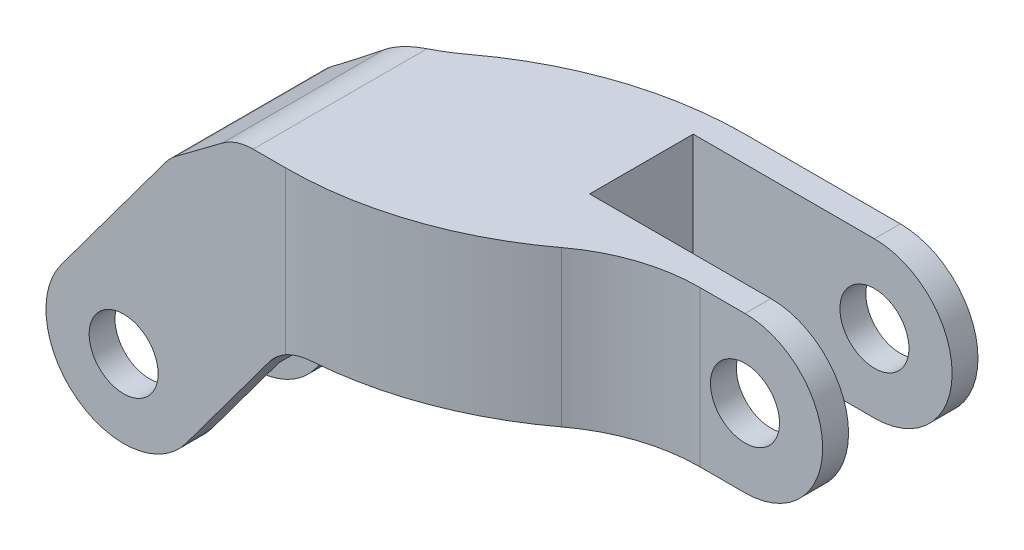
ISO-10303-21;
HEADER;
FILE_DESCRIPTION(('STEP AP214'),'2;1');
FILE_NAME('part.step','',(''),(''),'','','');
FILE_SCHEMA(('AUTOMOTIVE_DESIGN { 1 0 10303 214 1 1 1 1 }'));
ENDSEC;
DATA;
#1=APPLICATION_CONTEXT('core data for automotive mechanical design processes');
#2=APPLICATION_PROTOCOL_DEFINITION('international standard','automotive_design',2000,#1);
#3=PRODUCT_CONTEXT('',#1,'mechanical');
#4=PRODUCT('Part','Part','',(#3));
#5=PRODUCT_RELATED_PRODUCT_CATEGORY('part','',(#4));
#6=PRODUCT_DEFINITION_FORMATION('','',#4);
#7=PRODUCT_DEFINITION_CONTEXT('part definition',#1,'design');
#8=PRODUCT_DEFINITION('design','',#6,#7);
#9=PRODUCT_DEFINITION_SHAPE('','',#8);
#10=(LENGTH_UNIT() NAMED_UNIT(*) SI_UNIT(.MILLI.,.METRE.));
#11=(NAMED_UNIT(*) PLANE_ANGLE_UNIT() SI_UNIT($,.RADIAN.));
#12=(NAMED_UNIT(*) SI_UNIT($,.STERADIAN.) SOLID_ANGLE_UNIT());
#13=UNCERTAINTY_MEASURE_WITH_UNIT(LENGTH_MEASURE(1.E-05),#10,'distance_accuracy_value','');
#14=(GEOMETRIC_REPRESENTATION_CONTEXT(3) GLOBAL_UNCERTAINTY_ASSIGNED_CONTEXT((#13)) GLOBAL_UNIT_ASSIGNED_CONTEXT((#10,
#11,#12)) REPRESENTATION_CONTEXT('',''));
#15=CARTESIAN_POINT('',(0.,0.,0.));
#16=DIRECTION('',(0.,0.,1.));
#17=DIRECTION('',(1.,0.,0.));
#18=AXIS2_PLACEMENT_3D('',#15,#16,#17);
#19=CARTESIAN_POINT('',(30.,9.52817397962899,15.));
#20=DIRECTION('',(0.,0.,-1.));
#21=DIRECTION('',(-1.,0.,0.));
#22=AXIS2_PLACEMENT_3D('',#19,#20,#21);
#23=CYLINDRICAL_SURFACE('',#22,4.5);
#24=DIRECTION('',(0.,0.,-1.));
#25=VECTOR('',#24,1.);
#26=CARTESIAN_POINT('',(30.,14.028173979629,15.));
#27=LINE('',#26,#25);
#28=CARTESIAN_POINT('',(30.,14.028173979629,1.49999999999999));
#29=VERTEX_POINT('',#28);
#30=CARTESIAN_POINT('',(30.,14.028173979629,0.));
#31=VERTEX_POINT('',#30);
#32=EDGE_CURVE('E695',#29,#31,#27,.T.);
#33=ORIENTED_EDGE('',*,*,#32,.F.);
#34=CARTESIAN_POINT('',(30.,9.52817397962899,1.49999999999999));
#35=DIRECTION('',(0.,0.,1.));
#36=DIRECTION('',(1.,0.,0.));
#37=AXIS2_PLACEMENT_3D('',#34,#35,#36);
#38=CIRCLE('',#37,4.5);
#39=CARTESIAN_POINT('',(30.,5.02817397962899,1.49999999999999));
#40=VERTEX_POINT('',#39);
#41=EDGE_CURVE('E777',#40,#29,#38,.T.);
#42=ORIENTED_EDGE('',*,*,#41,.F.);
#43=DIRECTION('',(0.,0.,-1.));
#44=VECTOR('',#43,1.);
#45=CARTESIAN_POINT('',(30.,5.02817397962899,15.));
#46=LINE('',#45,#44);
#47=CARTESIAN_POINT('',(30.,5.02817397962899,0.));
#48=VERTEX_POINT('',#47);
#49=EDGE_CURVE('E233',#40,#48,#46,.T.);
#50=ORIENTED_EDGE('',*,*,#49,.T.);
#51=CARTESIAN_POINT('',(30.,9.52817397962899,0.));
#52=DIRECTION('',(0.,0.,1.));
#53=DIRECTION('',(-1.,0.,0.));
#54=AXIS2_PLACEMENT_3D('',#51,#52,#53);
#55=CIRCLE('',#54,4.5);
#56=EDGE_CURVE('E679',#48,#31,#55,.T.);
#57=ORIENTED_EDGE('',*,*,#56,.T.);
#58=EDGE_LOOP('',(#33,#42,#50,#57));
#59=FACE_BOUND('',#58,.T.);
#60=ADVANCED_FACE('F37',(#59),#23,.T.);
#61=CARTESIAN_POINT('',(30.,9.52817397962899,15.));
#62=DIRECTION('',(0.,0.,-1.));
#63=DIRECTION('',(-1.,0.,0.));
#64=AXIS2_PLACEMENT_3D('',#61,#62,#63);
#65=CYLINDRICAL_SURFACE('',#64,2.00000000000031);
#66=CARTESIAN_POINT('',(30.,9.52817397962899,0.));
#67=DIRECTION('',(0.,0.,1.));
#68=DIRECTION('',(1.,0.,0.));
#69=AXIS2_PLACEMENT_3D('',#66,#67,#68);
#70=CIRCLE('',#69,2.00000000000031);
#71=CARTESIAN_POINT('',(32.0000000000003,9.52817397962899,0.));
#72=VERTEX_POINT('',#71);
#73=EDGE_CURVE('E652',#72,#72,#70,.T.);
#74=ORIENTED_EDGE('',*,*,#73,.F.);
#75=EDGE_LOOP('',(#74));
#76=FACE_BOUND('',#75,.T.);
#77=CARTESIAN_POINT('',(30.,9.52817397962899,1.49999999999999));
#78=DIRECTION('',(0.,0.,1.));
#79=DIRECTION('',(1.,0.,0.));
#80=AXIS2_PLACEMENT_3D('',#77,#78,#79);
#81=CIRCLE('',#80,2.00000000000031);
#82=CARTESIAN_POINT('',(32.0000000000003,9.52817397962899,1.49999999999999));
#83=VERTEX_POINT('',#82);
#84=EDGE_CURVE('E262',#83,#83,#81,.T.);
#85=ORIENTED_EDGE('',*,*,#84,.T.);
#86=EDGE_LOOP('',(#85));
#87=FACE_BOUND('',#86,.T.);
#88=ADVANCED_FACE('F369',(#76,#87),#65,.F.);
#89=CARTESIAN_POINT('',(0.,0.,15.));
#90=DIRECTION('',(0.,0.,-1.));
#91=DIRECTION('',(-1.,0.,0.));
#92=AXIS2_PLACEMENT_3D('',#89,#90,#91);
#93=CYLINDRICAL_SURFACE('',#92,4.50006989301371);
#94=DIRECTION('',(0.,0.,-1.));
#95=VECTOR('',#94,1.);
#96=CARTESIAN_POINT('',(-3.61477800017651,2.68030017935461,15.));
#97=LINE('',#96,#95);
#98=CARTESIAN_POINT('',(-3.61477800017651,2.68030017935461,15.));
#99=VERTEX_POINT('',#98);
#100=CARTESIAN_POINT('',(-3.61477800017651,2.68030017935461,13.5));
#101=VERTEX_POINT('',#100);
#102=EDGE_CURVE('E684',#99,#101,#97,.T.);
#103=ORIENTED_EDGE('',*,*,#102,.T.);
#104=CARTESIAN_POINT('',(0.,0.,13.5));
#105=DIRECTION('',(0.,0.,-1.));
#106=DIRECTION('',(-1.,0.,0.));
#107=AXIS2_PLACEMENT_3D('',#104,#105,#106);
#108=CIRCLE('',#107,4.50006989301371);
#109=CARTESIAN_POINT('',(3.63579171584223,-2.65172540829955,13.5));
#110=VERTEX_POINT('',#109);
#111=EDGE_CURVE('E648',#110,#101,#108,.T.);
#112=ORIENTED_EDGE('',*,*,#111,.F.);
#113=DIRECTION('',(0.,0.,-1.));
#114=VECTOR('',#113,1.);
#115=CARTESIAN_POINT('',(3.63579171584223,-2.65172540829955,15.));
#116=LINE('',#115,#114);
#117=CARTESIAN_POINT('',(3.63579171584223,-2.65172540829955,15.));
#118=VERTEX_POINT('',#117);
#119=EDGE_CURVE('E243',#118,#110,#116,.T.);
#120=ORIENTED_EDGE('',*,*,#119,.F.);
#121=CARTESIAN_POINT('',(0.,0.,15.));
#122=DIRECTION('',(0.,0.,1.));
#123=DIRECTION('',(1.,0.,0.));
#124=AXIS2_PLACEMENT_3D('',#121,#122,#123);
#125=CIRCLE('',#124,4.50006989301371);
#126=EDGE_CURVE('E659',#99,#118,#125,.T.);
#127=ORIENTED_EDGE('',*,*,#126,.F.);
#128=EDGE_LOOP('',(#103,#112,#120,#127));
#129=FACE_BOUND('',#128,.T.);
#130=ADVANCED_FACE('F305',(#129),#93,.T.);
#131=CARTESIAN_POINT('',(0.,0.,6.));
#132=DIRECTION('',(0.,0.,1.));
#133=DIRECTION('',(1.,0.,0.));
#134=AXIS2_PLACEMENT_3D('',#131,#132,#133);
#135=CIRCLE('',#134,4.50006989301371);
#136=CARTESIAN_POINT('',(-3.61477800017651,2.68030017935461,6.));
#137=VERTEX_POINT('',#136);
#138=CARTESIAN_POINT('',(2.99794681119186,-3.35603098306213,6.));
#139=VERTEX_POINT('',#138);
#140=EDGE_CURVE('E727',#137,#139,#135,.T.);
#141=ORIENTED_EDGE('',*,*,#140,.T.);
#142=CARTESIAN_POINT('',(2.99794681119186,-3.35603098306213,6.));
#143=CARTESIAN_POINT('',(3.05721537620873,-3.30308930740904,6.00000044539146));
#144=CARTESIAN_POINT('',(3.11507687441391,-3.24857578496629,5.99947308640466));
#145=CARTESIAN_POINT('',(3.22766412446381,-3.13673179344954,5.9975191108706));
#146=CARTESIAN_POINT('',(3.28239841599539,-3.07940987667575,5.99609508490969));
#147=CARTESIAN_POINT('',(3.38875184710846,-2.96196996034142,5.99250237637154));
#148=CARTESIAN_POINT('',(3.4403710163522,-2.90185198741462,5.99033370088619));
#149=CARTESIAN_POINT('',(3.54049928532614,-2.77881400136558,5.98539709813684));
#150=CARTESIAN_POINT('',(3.58899898553246,-2.71588640665253,5.98262746054062));
#151=CARTESIAN_POINT('',(3.6357917158423,-2.65172540829946,5.97963696121314));
#152=B_SPLINE_CURVE_WITH_KNOTS('',3,(#142,#143,#144,#145,#146,#147,#148,#149,#150,#151),
.UNSPECIFIED.,.F.,.F.,(4,2,2,2,4),(0.,0.238379095459949,0.476072623312873,0.713763887487652,
0.952140705107862),.UNSPECIFIED.);
#153=CARTESIAN_POINT('',(3.63579171584223,-2.65172540829955,5.97963696121314));
#154=VERTEX_POINT('',#153);
#155=EDGE_CURVE('E318',#139,#154,#152,.T.);
#156=ORIENTED_EDGE('',*,*,#155,.T.);
#157=CARTESIAN_POINT('',(3.63579171584223,-2.65172540829955,7.5));
#158=VERTEX_POINT('',#157);
#159=EDGE_CURVE('E242',#158,#154,#116,.T.);
#160=ORIENTED_EDGE('',*,*,#159,.F.);
#161=CARTESIAN_POINT('',(0.,0.,7.5));
#162=DIRECTION('',(0.,0.,-1.));
#163=DIRECTION('',(-1.,0.,0.));
#164=AXIS2_PLACEMENT_3D('',#161,#162,#163);
#165=CIRCLE('',#164,4.50006989301371);
#166=CARTESIAN_POINT('',(-3.61477800017651,2.68030017935461,7.5));
#167=VERTEX_POINT('',#166);
#168=EDGE_CURVE('E643',#158,#167,#165,.T.);
#169=ORIENTED_EDGE('',*,*,#168,.T.);
#170=EDGE_CURVE('E677',#167,#137,#97,.T.);
#171=ORIENTED_EDGE('',*,*,#170,.T.);
#172=EDGE_LOOP('',(#141,#156,#160,#169,#171));
#173=FACE_BOUND('',#172,.T.);
#174=ADVANCED_FACE('F434',(#173),#93,.T.);
#175=CARTESIAN_POINT('',(3.63579171584223,-2.65172540829955,15.));
#176=DIRECTION('',(-0.803271523801974,0.595613011148056,0.));
#177=DIRECTION('',(-0.595613011148056,-0.803271523801974,0.));
#178=AXIS2_PLACEMENT_3D('',#175,#176,#177);
#179=PLANE('',#178);
#180=ORIENTED_EDGE('',*,*,#159,.T.);
#181=CARTESIAN_POINT('',(2.99794681119186,-3.51195283603865,-4.));
#182=DIRECTION('',(-0.803271523801974,0.595613011148056,0.));
#183=DIRECTION('',(-0.595613011148056,-0.803271523801974,0.));
#184=AXIS2_PLACEMENT_3D('',#181,#182,#183);
#185=ELLIPSE('',#184,16.7894250340918,10.);
#186=CARTESIAN_POINT('',(8.43077501766553,3.81501301307316,4.39549746464997));
#187=VERTEX_POINT('',#186);
#188=EDGE_CURVE('E324',#154,#187,#185,.T.);
#189=ORIENTED_EDGE('',*,*,#188,.T.);
#190=DIRECTION('',(0.,0.,-1.));
#191=VECTOR('',#190,1.);
#192=CARTESIAN_POINT('',(8.43077501766553,3.81501301307316,15.));
#193=LINE('',#192,#191);
#194=CARTESIAN_POINT('',(8.43077501766553,3.81501301307316,15.));
#195=VERTEX_POINT('',#194);
#196=EDGE_CURVE('E235',#195,#187,#193,.T.);
#197=ORIENTED_EDGE('',*,*,#196,.F.);
#198=DIRECTION('',(0.595613011148056,0.803271523801974,0.));
#199=VECTOR('',#198,1.);
#200=CARTESIAN_POINT('',(3.63579171584223,-2.65172540829955,15.));
#201=LINE('',#200,#199);
#202=EDGE_CURVE('E662',#118,#195,#201,.T.);
#203=ORIENTED_EDGE('',*,*,#202,.F.);
#204=ORIENTED_EDGE('',*,*,#119,.T.);
#205=DIRECTION('',(-0.595613011148056,-0.803271523801974,0.));
#206=VECTOR('',#205,1.);
#207=CARTESIAN_POINT('',(3.63579171584223,-2.65172540829955,13.5));
#208=LINE('',#207,#206);
#209=CARTESIAN_POINT('',(7.49993010698629,2.55963209319805,13.5));
#210=VERTEX_POINT('',#209);
#211=EDGE_CURVE('E650',#210,#110,#208,.T.);
#212=ORIENTED_EDGE('',*,*,#211,.F.);
#213=DIRECTION('',(0.,0.,1.));
#214=VECTOR('',#213,1.);
#215=CARTESIAN_POINT('',(7.49993010698629,2.55963209319805,15.));
#216=LINE('',#215,#214);
#217=CARTESIAN_POINT('',(7.49993010698629,2.55963209319805,7.49999999999999));
#218=VERTEX_POINT('',#217);
#219=EDGE_CURVE('E259',#218,#210,#216,.T.);
#220=ORIENTED_EDGE('',*,*,#219,.F.);
#221=DIRECTION('',(-0.595613011148056,-0.803271523801974,0.));
#222=VECTOR('',#221,1.);
#223=CARTESIAN_POINT('',(3.63579171584223,-2.65172540829955,7.5));
#224=LINE('',#223,#222);
#225=EDGE_CURVE('E256',#218,#158,#224,.T.);
#226=ORIENTED_EDGE('',*,*,#225,.T.);
#227=EDGE_LOOP('',(#180,#189,#197,#203,#204,#212,#220,#226));
#228=FACE_BOUND('',#227,.T.);
#229=ADVANCED_FACE('F340',(#228),#179,.F.);
#230=CARTESIAN_POINT('',(-3.61477800017651,2.68030017935461,15.));
#231=DIRECTION('',(0.803271523801974,-0.595613011148056,0.));
#232=DIRECTION('',(0.595613011148056,0.803271523801974,0.));
#233=AXIS2_PLACEMENT_3D('',#230,#231,#232);
#234=PLANE('',#233);
#235=DIRECTION('',(0.,0.,-1.));
#236=VECTOR('',#235,1.);
#237=CARTESIAN_POINT('',(2.41787806611709,10.8162218940337,15.));
#238=LINE('',#237,#236);
#239=CARTESIAN_POINT('',(2.41787806611709,10.8162218940337,15.));
#240=VERTEX_POINT('',#239);
#241=CARTESIAN_POINT('',(2.41787806611709,10.8162218940337,6.));
#242=VERTEX_POINT('',#241);
#243=EDGE_CURVE('E687',#240,#242,#238,.T.);
#244=ORIENTED_EDGE('',*,*,#243,.T.);
#245=DIRECTION('',(-0.595613011148056,-0.803271523801974,0.));
#246=VECTOR('',#245,1.);
#247=CARTESIAN_POINT('',(-3.61477800017651,2.68030017935461,6.));
#248=LINE('',#247,#246);
#249=EDGE_CURVE('E767',#242,#137,#248,.T.);
#250=ORIENTED_EDGE('',*,*,#249,.T.);
#251=ORIENTED_EDGE('',*,*,#170,.F.);
#252=DIRECTION('',(0.595613011148056,0.803271523801974,0.));
#253=VECTOR('',#252,1.);
#254=CARTESIAN_POINT('',(-3.61477800017651,2.6803001793546,7.5));
#255=LINE('',#254,#253);
#256=CARTESIAN_POINT('',(-1.15327358019696,6.,7.5));
#257=VERTEX_POINT('',#256);
#258=EDGE_CURVE('E250',#167,#257,#255,.T.);
#259=ORIENTED_EDGE('',*,*,#258,.T.);
#260=DIRECTION('',(0.,0.,1.));
#261=VECTOR('',#260,1.);
#262=CARTESIAN_POINT('',(-1.15327358019696,6.,15.));
#263=LINE('',#262,#261);
#264=CARTESIAN_POINT('',(-1.15327358019696,6.,13.5));
#265=VERTEX_POINT('',#264);
#266=EDGE_CURVE('E246',#257,#265,#263,.T.);
#267=ORIENTED_EDGE('',*,*,#266,.T.);
#268=DIRECTION('',(0.595613011148056,0.803271523801974,0.));
#269=VECTOR('',#268,1.);
#270=CARTESIAN_POINT('',(-3.61477800017651,2.68030017935461,13.5));
#271=LINE('',#270,#269);
#272=EDGE_CURVE('E255',#101,#265,#271,.T.);
#273=ORIENTED_EDGE('',*,*,#272,.F.);
#274=ORIENTED_EDGE('',*,*,#102,.F.);
#275=DIRECTION('',(-0.595613011148056,-0.803271523801974,0.));
#276=VECTOR('',#275,1.);
#277=CARTESIAN_POINT('',(-3.61477800017651,2.68030017935461,15.));
#278=LINE('',#277,#276);
#279=EDGE_CURVE('E675',#240,#99,#278,.T.);
#280=ORIENTED_EDGE('',*,*,#279,.F.);
#281=EDGE_LOOP('',(#244,#250,#251,#259,#267,#273,#274,#280));
#282=FACE_BOUND('',#281,.T.);
#283=ADVANCED_FACE('F415',(#282),#234,.F.);
#284=CARTESIAN_POINT('',(0.,0.,15.));
#285=DIRECTION('',(0.,0.,-1.));
#286=DIRECTION('',(-1.,0.,0.));
#287=AXIS2_PLACEMENT_3D('',#284,#285,#286);
#288=CYLINDRICAL_SURFACE('',#287,2.);
#289=CARTESIAN_POINT('',(0.,0.,15.));
#290=DIRECTION('',(0.,0.,1.));
#291=DIRECTION('',(1.,0.,0.));
#292=AXIS2_PLACEMENT_3D('',#289,#290,#291);
#293=CIRCLE('',#292,2.);
#294=CARTESIAN_POINT('',(2.,0.,15.));
#295=VERTEX_POINT('',#294);
#296=EDGE_CURVE('E655',#295,#295,#293,.T.);
#297=ORIENTED_EDGE('',*,*,#296,.T.);
#298=EDGE_LOOP('',(#297));
#299=FACE_BOUND('',#298,.T.);
#300=CARTESIAN_POINT('',(0.,0.,13.5));
#301=DIRECTION('',(0.,0.,-1.));
#302=DIRECTION('',(-1.,0.,0.));
#303=AXIS2_PLACEMENT_3D('',#300,#301,#302);
#304=CIRCLE('',#303,2.);
#305=CARTESIAN_POINT('',(-2.,0.,13.5));
#306=VERTEX_POINT('',#305);
#307=EDGE_CURVE('E252',#306,#306,#304,.T.);
#308=ORIENTED_EDGE('',*,*,#307,.T.);
#309=EDGE_LOOP('',(#308));
#310=FACE_BOUND('',#309,.T.);
#311=ADVANCED_FACE('F406',(#299,#310),#288,.F.);
#312=CARTESIAN_POINT('',(0.,0.,15.));
#313=DIRECTION('',(0.,0.,1.));
#314=DIRECTION('',(1.,0.,0.));
#315=AXIS2_PLACEMENT_3D('',#312,#313,#314);
#316=PLANE('',#315);
#317=CARTESIAN_POINT('',(10.8405895890715,2.02817397962899,15.));
#318=DIRECTION('',(0.,0.,-1.));
#319=DIRECTION('',(-1.,0.,0.));
#320=AXIS2_PLACEMENT_3D('',#317,#318,#319);
#321=CIRCLE('',#320,3.);
#322=CARTESIAN_POINT('',(9.38305496253333,4.65030914251483,15.));
#323=VERTEX_POINT('',#322);
#324=EDGE_CURVE('E665',#195,#323,#321,.T.);
#325=ORIENTED_EDGE('',*,*,#324,.T.);
#326=DIRECTION('',(0.,-1.,0.));
#327=VECTOR('',#326,1.);
#328=CARTESIAN_POINT('',(9.38305496253333,14.028173979629,15.));
#329=LINE('',#328,#327);
#330=CARTESIAN_POINT('',(9.38305496253333,14.028173979629,15.));
#331=VERTEX_POINT('',#330);
#332=EDGE_CURVE('E46',#323,#331,#329,.F.);
#333=ORIENTED_EDGE('',*,*,#332,.T.);
#334=DIRECTION('',(-1.,0.,0.));
#335=VECTOR('',#334,1.);
#336=CARTESIAN_POINT('',(7.50252834309378,14.028173979629,15.));
#337=LINE('',#336,#335);
#338=CARTESIAN_POINT('',(7.50252834309378,14.028173979629,15.));
#339=VERTEX_POINT('',#338);
#340=EDGE_CURVE('E667',#331,#339,#337,.T.);
#341=ORIENTED_EDGE('',*,*,#340,.T.);
#342=CARTESIAN_POINT('',(7.50252834309378,11.028173979629,15.));
#343=DIRECTION('',(0.,0.,1.));
#344=DIRECTION('',(-1.,0.,0.));
#345=AXIS2_PLACEMENT_3D('',#342,#343,#344);
#346=CIRCLE('',#345,3.);
#347=CARTESIAN_POINT('',(5.70674910489284,13.4313337595118,15.));
#348=VERTEX_POINT('',#347);
#349=EDGE_CURVE('E669',#339,#348,#346,.T.);
#350=ORIENTED_EDGE('',*,*,#349,.T.);
#351=DIRECTION('',(-0.801053259960941,-0.598593079400313,0.));
#352=VECTOR('',#351,1.);
#353=CARTESIAN_POINT('',(3.03191339932207,11.4325426404724,15.));
#354=LINE('',#353,#352);
#355=CARTESIAN_POINT('',(3.03191339932207,11.4325426404724,15.));
#356=VERTEX_POINT('',#355);
#357=EDGE_CURVE('E671',#348,#356,#354,.T.);
#358=ORIENTED_EDGE('',*,*,#357,.T.);
#359=CARTESIAN_POINT('',(4.82769263752301,9.02938286058956,15.));
#360=DIRECTION('',(0.,0.,1.));
#361=DIRECTION('',(-1.,0.,0.));
#362=AXIS2_PLACEMENT_3D('',#359,#360,#361);
#363=CIRCLE('',#362,3.);
#364=EDGE_CURVE('E673',#356,#240,#363,.T.);
#365=ORIENTED_EDGE('',*,*,#364,.T.);
#366=ORIENTED_EDGE('',*,*,#279,.T.);
#367=ORIENTED_EDGE('',*,*,#126,.T.);
#368=ORIENTED_EDGE('',*,*,#202,.T.);
#369=EDGE_LOOP('',(#325,#333,#341,#350,#358,#365,#366,#367,#368));
#370=FACE_BOUND('',#369,.T.);
#371=ORIENTED_EDGE('',*,*,#296,.F.);
#372=EDGE_LOOP('',(#371));
#373=FACE_BOUND('',#372,.T.);
#374=ADVANCED_FACE('F398',(#370,#373),#316,.T.);
#375=CARTESIAN_POINT('',(0.,0.,0.));
#376=DIRECTION('',(0.,0.,1.));
#377=DIRECTION('',(1.,0.,0.));
#378=AXIS2_PLACEMENT_3D('',#375,#376,#377);
#379=PLANE('',#378);
#380=DIRECTION('',(1.,0.,0.));
#381=VECTOR('',#380,1.);
#382=CARTESIAN_POINT('',(10.8405895890715,5.02817397962899,0.));
#383=LINE('',#382,#381);
#384=CARTESIAN_POINT('',(20.9979468111919,5.02817397962899,0.));
#385=VERTEX_POINT('',#384);
#386=EDGE_CURVE('E658',#385,#48,#383,.T.);
#387=ORIENTED_EDGE('',*,*,#386,.F.);
#388=DIRECTION('',(0.,-1.,0.));
#389=VECTOR('',#388,1.);
#390=CARTESIAN_POINT('',(20.9979468111919,0.,0.));
#391=LINE('',#390,#389);
#392=CARTESIAN_POINT('',(20.9979468111919,14.028173979629,0.));
#393=VERTEX_POINT('',#392);
#394=EDGE_CURVE('E745',#385,#393,#391,.F.);
#395=ORIENTED_EDGE('',*,*,#394,.T.);
#396=DIRECTION('',(-1.,0.,0.));
#397=VECTOR('',#396,1.);
#398=CARTESIAN_POINT('',(7.50252834309378,14.028173979629,0.));
#399=LINE('',#398,#397);
#400=EDGE_CURVE('E663',#31,#393,#399,.T.);
#401=ORIENTED_EDGE('',*,*,#400,.F.);
#402=ORIENTED_EDGE('',*,*,#56,.F.);
#403=EDGE_LOOP('',(#387,#395,#401,#402));
#404=FACE_BOUND('',#403,.T.);
#405=ORIENTED_EDGE('',*,*,#73,.T.);
#406=EDGE_LOOP('',(#405));
#407=FACE_BOUND('',#406,.T.);
#408=ADVANCED_FACE('F338',(#404,#407),#379,.F.);
#409=CARTESIAN_POINT('',(10.8405895890715,2.02817397962899,15.));
#410=DIRECTION('',(0.,0.,-1.));
#411=DIRECTION('',(-1.,0.,0.));
#412=AXIS2_PLACEMENT_3D('',#409,#410,#411);
#413=CYLINDRICAL_SURFACE('',#412,3.);
#414=CARTESIAN_POINT('',(8.43077501766553,3.81501301307316,4.39549746464997));
#415=CARTESIAN_POINT('',(8.48189768196184,3.88398661619315,4.36242253601787));
#416=CARTESIAN_POINT('',(8.53546396387886,3.95001612814078,4.32709016753339));
#417=CARTESIAN_POINT('',(8.64654794767399,4.07590283799544,4.25213652492582));
#418=CARTESIAN_POINT('',(8.7040614817097,4.13576638432781,4.21251974994));
#419=CARTESIAN_POINT('',(8.82150847291482,4.24850402748144,4.12965159804229));
#420=CARTESIAN_POINT('',(8.88140481693196,4.30145307317986,4.08644929025741));
#421=CARTESIAN_POINT('',(9.00343529177038,4.40116324613896,3.99624176117752));
#422=CARTESIAN_POINT('',(9.06556990731079,4.44792302268058,3.94923571336569));
#423=CARTESIAN_POINT('',(9.25366005981153,4.57863878325539,3.80327140172598));
#424=CARTESIAN_POINT('',(9.38186184324004,4.65355390281376,3.69897769358106));
#425=CARTESIAN_POINT('',(9.63964422523659,4.78109678790936,3.47776181047654));
#426=CARTESIAN_POINT('',(9.76922850370682,4.83359184428193,3.36076944424461));
#427=CARTESIAN_POINT('',(9.98051487672307,4.90358140374317,3.15940183451532));
#428=CARTESIAN_POINT('',(10.0631274170651,4.92689648895338,3.07791251634549));
#429=CARTESIAN_POINT('',(10.2263756345269,4.96582342227423,2.91110923203279));
#430=CARTESIAN_POINT('',(10.3070102098441,4.98143106566596,2.82579320588855));
#431=CARTESIAN_POINT('',(10.4649086404733,5.00562057229445,2.65267405809196));
#432=CARTESIAN_POINT('',(10.5421972792128,5.01426791419201,2.56490235055671));
#433=CARTESIAN_POINT('',(10.6937346740502,5.02553681838982,2.38659299029854));
#434=CARTESIAN_POINT('',(10.7679873715213,5.02816645392668,2.29605920865483));
#435=CARTESIAN_POINT('',(10.8405895890715,5.02817397962899,2.204269034993));
#436=B_SPLINE_CURVE_WITH_KNOTS('',3,(#414,#415,#416,#417,#418,#419,#420,#421,#422,#423,#424,
#425,#426,#427,#428,#429,#430,#431,#432,#433,#434,#435),.UNSPECIFIED.,.F.,.F.,(4,2,2,2,2,2,2,2,
2,2,4),(0.,0.275852431486783,0.551417947361566,0.823691763027624,1.09602490091545,
1.63814403108027,2.18342904315912,2.53819282783634,2.89314993718026,3.24472744543976,
3.59583300700978),.UNSPECIFIED.);
#437=CARTESIAN_POINT('',(8.99794681119186,4.39559189650133,4.));
#438=VERTEX_POINT('',#437);
#439=EDGE_CURVE('E326',#187,#438,#436,.T.);
#440=ORIENTED_EDGE('',*,*,#439,.T.);
#441=CARTESIAN_POINT('',(8.99794681119186,4.39559189650133,4.));
#442=CARTESIAN_POINT('',(9.08596126598724,4.46407307649459,3.93397386682113));
#443=CARTESIAN_POINT('',(9.17716462264162,4.52720399700254,3.86672063758911));
#444=CARTESIAN_POINT('',(9.36515322271957,4.64261143160944,3.73065935685439));
#445=CARTESIAN_POINT('',(9.46193959554557,4.69488573958813,3.6618509924838));
#446=CARTESIAN_POINT('',(9.65776278258308,4.78721973890493,3.52534843130114));
#447=CARTESIAN_POINT('',(9.75668140300862,4.82755406843653,3.45766985995113));
#448=CARTESIAN_POINT('',(9.95827374483168,4.89747654779908,3.32245987096747));
#449=CARTESIAN_POINT('',(10.0609457544234,4.92706953075767,3.25492840077516));
#450=CARTESIAN_POINT('',(10.2742346430119,4.97635566617258,3.11750059332312));
#451=CARTESIAN_POINT('',(10.3849984555718,4.99552061490043,3.0476415141216));
#452=CARTESIAN_POINT('',(10.6104386612997,5.02151186542868,2.90855090664251));
#453=CARTESIAN_POINT('',(10.7251476914567,5.02816804889028,2.83934059263895));
#454=CARTESIAN_POINT('',(10.8405895890715,5.02817397962899,2.7713002736063));
#455=B_SPLINE_CURVE_WITH_KNOTS('',3,(#441,#442,#443,#444,#445,#446,#447,#448,#449,#450,#451,
#452,#453,#454),.UNSPECIFIED.,.F.,.F.,(4,2,2,2,2,2,4),(0.,0.388588270473219,0.777255427014955,
1.15612711105552,1.53482810775831,1.9312545805181,2.33303446940445),.UNSPECIFIED.);
#456=CARTESIAN_POINT('',(10.8405895890715,5.02817397962899,2.77130027360629));
#457=VERTEX_POINT('',#456);
#458=EDGE_CURVE('E349',#438,#457,#455,.T.);
#459=ORIENTED_EDGE('',*,*,#458,.T.);
#460=DIRECTION('',(0.,0.,-1.));
#461=VECTOR('',#460,1.);
#462=CARTESIAN_POINT('',(10.8405895890715,5.02817397962899,15.));
#463=LINE('',#462,#461);
#464=CARTESIAN_POINT('',(10.8405895890715,5.02817397962899,14.9468191151482));
#465=VERTEX_POINT('',#464);
#466=EDGE_CURVE('E232',#465,#457,#463,.T.);
#467=ORIENTED_EDGE('',*,*,#466,.F.);
#468=CARTESIAN_POINT('',(10.8405895890715,5.02817397962899,14.9468191151482));
#469=CARTESIAN_POINT('',(10.7563117086555,5.02818398549448,14.9529828375379));
#470=CARTESIAN_POINT('',(10.6719934708743,5.0246229710458,14.9586018047168));
#471=CARTESIAN_POINT('',(10.5038633948732,5.01040789927682,14.968746211969));
#472=CARTESIAN_POINT('',(10.4200517277378,4.99975156745515,14.9732713007503));
#473=CARTESIAN_POINT('',(10.255331564006,4.97169382429791,14.9811361867135));
#474=CARTESIAN_POINT('',(10.1743991129022,4.95443934869043,14.9844989609991));
#475=CARTESIAN_POINT('',(10.014237344964,4.91330398769315,14.9901982644377));
#476=CARTESIAN_POINT('',(9.9350072999798,4.88942599863649,14.9925352410011));
#477=CARTESIAN_POINT('',(9.77552435536118,4.83406936985403,14.9963141702882));
#478=CARTESIAN_POINT('',(9.6953656382105,4.80231624800193,14.9977149199668));
#479=CARTESIAN_POINT('',(9.53718211010449,4.73164117597302,14.999565457503));
#480=CARTESIAN_POINT('',(9.45919127561133,4.6926428825333,15.000004413478));
#481=CARTESIAN_POINT('',(9.38305496253333,4.65030914251483,15.));
#482=B_SPLINE_CURVE_WITH_KNOTS('',3,(#468,#469,#470,#471,#472,#473,#474,#475,#476,#477,#478,
#479,#480,#481),.UNSPECIFIED.,.F.,.F.,(4,2,2,2,2,2,4),(0.,0.253433402240283,0.506948085175109,
0.755118180466546,1.0031799264295,1.26154413810537,1.52280344922187),.UNSPECIFIED.);
#483=EDGE_CURVE('E59',#465,#323,#482,.T.);
#484=ORIENTED_EDGE('',*,*,#483,.T.);
#485=ORIENTED_EDGE('',*,*,#324,.F.);
#486=ORIENTED_EDGE('',*,*,#196,.T.);
#487=EDGE_LOOP('',(#440,#459,#467,#484,#485,#486));
#488=FACE_BOUND('',#487,.T.);
#489=ADVANCED_FACE('F334',(#488),#413,.F.);
#490=CARTESIAN_POINT('',(10.8405895890715,5.02817397962899,15.));
#491=DIRECTION('',(0.,1.,0.));
#492=DIRECTION('',(0.,0.,1.));
#493=AXIS2_PLACEMENT_3D('',#490,#491,#492);
#494=PLANE('',#493);
#495=ORIENTED_EDGE('',*,*,#466,.T.);
#496=CARTESIAN_POINT('',(20.9979468111919,5.02817397962899,20.));
#497=DIRECTION('',(0.,1.,0.));
#498=DIRECTION('',(0.,0.,1.));
#499=AXIS2_PLACEMENT_3D('',#496,#497,#498);
#500=CIRCLE('',#499,20.);
#501=EDGE_CURVE('E738',#457,#385,#500,.F.);
#502=ORIENTED_EDGE('',*,*,#501,.T.);
#503=ORIENTED_EDGE('',*,*,#386,.T.);
#504=ORIENTED_EDGE('',*,*,#49,.F.);
#505=DIRECTION('',(1.,0.,0.));
#506=VECTOR('',#505,1.);
#507=CARTESIAN_POINT('',(10.8405895890715,5.02817397962899,1.5));
#508=LINE('',#507,#506);
#509=CARTESIAN_POINT('',(19.5,5.02817397962899,1.5));
#510=VERTEX_POINT('',#509);
#511=EDGE_CURVE('E271',#510,#40,#508,.T.);
#512=ORIENTED_EDGE('',*,*,#511,.F.);
#513=DIRECTION('',(0.,0.,1.));
#514=VECTOR('',#513,1.);
#515=CARTESIAN_POINT('',(19.5,5.02817397962899,15.));
#516=LINE('',#515,#514);
#517=CARTESIAN_POINT('',(19.5,5.02817397962899,7.5));
#518=VERTEX_POINT('',#517);
#519=EDGE_CURVE('E712',#510,#518,#516,.T.);
#520=ORIENTED_EDGE('',*,*,#519,.T.);
#521=DIRECTION('',(1.,0.,0.));
#522=VECTOR('',#521,1.);
#523=CARTESIAN_POINT('',(10.8405895890715,5.02817397962899,7.5));
#524=LINE('',#523,#522);
#525=CARTESIAN_POINT('',(30.,5.02817397962899,7.5));
#526=VERTEX_POINT('',#525);
#527=EDGE_CURVE('E231',#518,#526,#524,.T.);
#528=ORIENTED_EDGE('',*,*,#527,.T.);
#529=CARTESIAN_POINT('',(30.,5.02817397962899,8.99999999999999));
#530=VERTEX_POINT('',#529);
#531=EDGE_CURVE('E222',#530,#526,#46,.T.);
#532=ORIENTED_EDGE('',*,*,#531,.F.);
#533=DIRECTION('',(-1.,0.,0.));
#534=VECTOR('',#533,1.);
#535=CARTESIAN_POINT('',(10.8405895890715,5.02817397962899,9.));
#536=LINE('',#535,#534);
#537=CARTESIAN_POINT('',(27.3830549625333,5.02817397962899,9.));
#538=VERTEX_POINT('',#537);
#539=EDGE_CURVE('E206',#530,#538,#536,.T.);
#540=ORIENTED_EDGE('',*,*,#539,.T.);
#541=CARTESIAN_POINT('',(27.3830549625333,5.02817397962899,19.));
#542=DIRECTION('',(0.,1.,0.));
#543=DIRECTION('',(0.,0.,1.));
#544=AXIS2_PLACEMENT_3D('',#541,#542,#543);
#545=CIRCLE('',#544,10.);
#546=CARTESIAN_POINT('',(21.3830549625333,5.02817397962899,11.));
#547=VERTEX_POINT('',#546);
#548=EDGE_CURVE('E741',#538,#547,#545,.T.);
#549=ORIENTED_EDGE('',*,*,#548,.T.);
#550=CARTESIAN_POINT('',(9.38305496253333,5.02817397962899,-5.));
#551=DIRECTION('',(0.,1.,0.));
#552=DIRECTION('',(0.,0.,1.));
#553=AXIS2_PLACEMENT_3D('',#550,#551,#552);
#554=CIRCLE('',#553,20.);
#555=EDGE_CURVE('E356',#547,#465,#554,.F.);
#556=ORIENTED_EDGE('',*,*,#555,.T.);
#557=EDGE_LOOP('',(#495,#502,#503,#504,#512,#520,#528,#532,#540,#549,#556));
#558=FACE_BOUND('',#557,.T.);
#559=ADVANCED_FACE('F229',(#558),#494,.F.);
#560=CARTESIAN_POINT('',(30.,14.028173979629,9.));
#561=VERTEX_POINT('',#560);
#562=CARTESIAN_POINT('',(30.,14.028173979629,7.5));
#563=VERTEX_POINT('',#562);
#564=EDGE_CURVE('E224',#561,#563,#27,.T.);
#565=ORIENTED_EDGE('',*,*,#564,.F.);
#566=CARTESIAN_POINT('',(30.,9.52817397962899,8.99999999999999));
#567=DIRECTION('',(0.,0.,-1.));
#568=DIRECTION('',(-1.,0.,0.));
#569=AXIS2_PLACEMENT_3D('',#566,#567,#568);
#570=CIRCLE('',#569,4.5);
#571=EDGE_CURVE('E210',#561,#530,#570,.T.);
#572=ORIENTED_EDGE('',*,*,#571,.T.);
#573=ORIENTED_EDGE('',*,*,#531,.T.);
#574=CARTESIAN_POINT('',(30.,9.52817397962899,7.5));
#575=DIRECTION('',(0.,0.,1.));
#576=DIRECTION('',(1.,0.,0.));
#577=AXIS2_PLACEMENT_3D('',#574,#575,#576);
#578=CIRCLE('',#577,4.5);
#579=EDGE_CURVE('E702',#526,#563,#578,.T.);
#580=ORIENTED_EDGE('',*,*,#579,.T.);
#581=EDGE_LOOP('',(#565,#572,#573,#580));
#582=FACE_BOUND('',#581,.T.);
#583=ADVANCED_FACE('F220',(#582),#23,.T.);
#584=CARTESIAN_POINT('',(7.50252834309378,14.028173979629,15.));
#585=DIRECTION('',(0.,-1.,0.));
#586=DIRECTION('',(1.,0.,0.));
#587=AXIS2_PLACEMENT_3D('',#584,#585,#586);
#588=PLANE('',#587);
#589=ORIENTED_EDGE('',*,*,#400,.T.);
#590=CARTESIAN_POINT('',(20.9979468111919,14.028173979629,20.));
#591=DIRECTION('',(0.,-1.,0.));
#592=DIRECTION('',(1.,0.,0.));
#593=AXIS2_PLACEMENT_3D('',#590,#591,#592);
#594=CIRCLE('',#593,20.);
#595=CARTESIAN_POINT('',(8.99794681119186,14.028173979629,4.));
#596=VERTEX_POINT('',#595);
#597=EDGE_CURVE('E746',#393,#596,#594,.F.);
#598=ORIENTED_EDGE('',*,*,#597,.T.);
#599=CARTESIAN_POINT('',(2.99794681119186,14.028173979629,-4.));
#600=DIRECTION('',(0.,-1.,0.));
#601=DIRECTION('',(1.,0.,0.));
#602=AXIS2_PLACEMENT_3D('',#599,#600,#601);
#603=CIRCLE('',#602,10.);
#604=CARTESIAN_POINT('',(7.50252834309378,14.028173979629,4.9279754268506));
#605=VERTEX_POINT('',#604);
#606=EDGE_CURVE('E282',#596,#605,#603,.T.);
#607=ORIENTED_EDGE('',*,*,#606,.T.);
#608=DIRECTION('',(0.,0.,-1.));
#609=VECTOR('',#608,1.);
#610=CARTESIAN_POINT('',(7.50252834309378,14.028173979629,15.));
#611=LINE('',#610,#609);
#612=EDGE_CURVE('E693',#339,#605,#611,.T.);
#613=ORIENTED_EDGE('',*,*,#612,.F.);
#614=ORIENTED_EDGE('',*,*,#340,.F.);
#615=CARTESIAN_POINT('',(9.38305496253333,14.028173979629,-5.));
#616=DIRECTION('',(0.,-1.,0.));
#617=DIRECTION('',(1.,0.,0.));
#618=AXIS2_PLACEMENT_3D('',#615,#616,#617);
#619=CIRCLE('',#618,20.);
#620=CARTESIAN_POINT('',(21.3830549625333,14.028173979629,11.));
#621=VERTEX_POINT('',#620);
#622=EDGE_CURVE('E737',#331,#621,#619,.F.);
#623=ORIENTED_EDGE('',*,*,#622,.T.);
#624=CARTESIAN_POINT('',(27.3830549625333,14.028173979629,19.));
#625=DIRECTION('',(0.,-1.,0.));
#626=DIRECTION('',(1.,0.,0.));
#627=AXIS2_PLACEMENT_3D('',#624,#625,#626);
#628=CIRCLE('',#627,10.);
#629=CARTESIAN_POINT('',(27.3830549625333,14.028173979629,8.99999999999999));
#630=VERTEX_POINT('',#629);
#631=EDGE_CURVE('E750',#621,#630,#628,.T.);
#632=ORIENTED_EDGE('',*,*,#631,.T.);
#633=DIRECTION('',(-1.,0.,0.));
#634=VECTOR('',#633,1.);
#635=CARTESIAN_POINT('',(34.5,14.028173979629,8.99999999999999));
#636=LINE('',#635,#634);
#637=EDGE_CURVE('E280',#561,#630,#636,.T.);
#638=ORIENTED_EDGE('',*,*,#637,.F.);
#639=ORIENTED_EDGE('',*,*,#564,.T.);
#640=DIRECTION('',(-1.,0.,0.));
#641=VECTOR('',#640,1.);
#642=CARTESIAN_POINT('',(7.50252834309378,14.028173979629,7.5));
#643=LINE('',#642,#641);
#644=CARTESIAN_POINT('',(19.5,14.028173979629,7.5));
#645=VERTEX_POINT('',#644);
#646=EDGE_CURVE('E270',#563,#645,#643,.T.);
#647=ORIENTED_EDGE('',*,*,#646,.T.);
#648=DIRECTION('',(0.,0.,-1.));
#649=VECTOR('',#648,1.);
#650=CARTESIAN_POINT('',(19.5,14.028173979629,15.));
#651=LINE('',#650,#649);
#652=CARTESIAN_POINT('',(19.5,14.028173979629,1.5));
#653=VERTEX_POINT('',#652);
#654=EDGE_CURVE('E261',#645,#653,#651,.T.);
#655=ORIENTED_EDGE('',*,*,#654,.T.);
#656=DIRECTION('',(-1.,0.,0.));
#657=VECTOR('',#656,1.);
#658=CARTESIAN_POINT('',(7.50252834309378,14.028173979629,1.5));
#659=LINE('',#658,#657);
#660=EDGE_CURVE('E265',#29,#653,#659,.T.);
#661=ORIENTED_EDGE('',*,*,#660,.F.);
#662=ORIENTED_EDGE('',*,*,#32,.T.);
#663=EDGE_LOOP('',(#589,#598,#607,#613,#614,#623,#632,#638,#639,#647,#655,#661,#662));
#664=FACE_BOUND('',#663,.T.);
#665=ADVANCED_FACE('F379',(#664),#588,.F.);
#666=CARTESIAN_POINT('',(7.50252834309378,11.028173979629,15.));
#667=DIRECTION('',(0.,0.,-1.));
#668=DIRECTION('',(-1.,0.,0.));
#669=AXIS2_PLACEMENT_3D('',#666,#667,#668);
#670=CYLINDRICAL_SURFACE('',#669,3.);
#671=ORIENTED_EDGE('',*,*,#612,.T.);
#672=CARTESIAN_POINT('',(7.50252834309378,14.028173979629,4.9279754268506));
#673=CARTESIAN_POINT('',(7.42058790749329,14.0281823541134,4.96933120449554));
#674=CARTESIAN_POINT('',(7.33804734527388,14.0248166806606,5.00954882651683));
#675=CARTESIAN_POINT('',(7.17232465144369,14.0111037591802,5.087513309154));
#676=CARTESIAN_POINT('',(7.08914216778381,14.0007523642556,5.12525868757589));
#677=CARTESIAN_POINT('',(6.92508377461169,13.9732184028162,5.19703243954956));
#678=CARTESIAN_POINT('',(6.84420743245108,13.956231819477,5.23113455174417));
#679=CARTESIAN_POINT('',(6.68313398297337,13.9152995058377,5.29660935151821));
#680=CARTESIAN_POINT('',(6.60293668063064,13.8913558486163,5.327982848561));
#681=CARTESIAN_POINT('',(6.45259751589232,13.8394477163246,5.38462146862911));
#682=CARTESIAN_POINT('',(6.38231478023922,13.8122088955424,5.41017942272105));
#683=CARTESIAN_POINT('',(6.2433446105451,13.7521757838776,5.45900725440972));
#684=CARTESIAN_POINT('',(6.17465710290602,13.7193817498737,5.48227723772597));
#685=CARTESIAN_POINT('',(6.03771400380125,13.6474191699244,5.5270733689958));
#686=CARTESIAN_POINT('',(5.96951232392968,13.6081115323854,5.54854123902931));
#687=CARTESIAN_POINT('',(5.83589251903275,13.5238869365582,5.58910698132125));
#688=CARTESIAN_POINT('',(5.77047535572683,13.4789680609955,5.60820403904101));
#689=CARTESIAN_POINT('',(5.70674910489284,13.4313337595118,5.62613058989126));
#690=B_SPLINE_CURVE_WITH_KNOTS('',3,(#672,#673,#674,#675,#676,#677,#678,#679,#680,#681,#682,
#683,#684,#685,#686,#687,#688,#689),.UNSPECIFIED.,.F.,.F.,(4,2,2,2,2,2,2,2,4),(0.,
0.275320201248216,0.550803983307061,0.818700879547862,1.08651802921357,1.32505882219867,
1.56358858782025,1.8080929396765,2.05268106463303),.UNSPECIFIED.);
#691=CARTESIAN_POINT('',(5.70674910489284,13.4313337595118,5.62613058989126));
#692=VERTEX_POINT('',#691);
#693=EDGE_CURVE('E284',#605,#692,#690,.T.);
#694=ORIENTED_EDGE('',*,*,#693,.T.);
#695=DIRECTION('',(0.,0.,-1.));
#696=VECTOR('',#695,1.);
#697=CARTESIAN_POINT('',(5.70674910489284,13.4313337595118,15.));
#698=LINE('',#697,#696);
#699=EDGE_CURVE('E692',#348,#692,#698,.T.);
#700=ORIENTED_EDGE('',*,*,#699,.F.);
#701=ORIENTED_EDGE('',*,*,#349,.F.);
#702=EDGE_LOOP('',(#671,#694,#700,#701));
#703=FACE_BOUND('',#702,.T.);
#704=ADVANCED_FACE('F294',(#703),#670,.T.);
#705=CARTESIAN_POINT('',(3.03191339932207,11.4325426404724,15.));
#706=DIRECTION('',(0.598593079400313,-0.801053259960941,0.));
#707=DIRECTION('',(0.801053259960941,0.598593079400313,0.));
#708=AXIS2_PLACEMENT_3D('',#705,#706,#707);
#709=PLANE('',#708);
#710=ORIENTED_EDGE('',*,*,#699,.T.);
#711=CARTESIAN_POINT('',(2.99794681119186,11.4071608517676,-4.));
#712=DIRECTION('',(0.598593079400313,-0.801053259960941,0.));
#713=DIRECTION('',(-0.801053259960941,-0.598593079400313,0.));
#714=AXIS2_PLACEMENT_3D('',#711,#712,#713);
#715=ELLIPSE('',#714,12.4835644517414,10.);
#716=CARTESIAN_POINT('',(3.03191339932207,11.4325426404724,5.99994231337815));
#717=VERTEX_POINT('',#716);
#718=EDGE_CURVE('E292',#692,#717,#715,.T.);
#719=ORIENTED_EDGE('',*,*,#718,.T.);
#720=DIRECTION('',(0.,0.,-1.));
#721=VECTOR('',#720,1.);
#722=CARTESIAN_POINT('',(3.03191339932207,11.4325426404724,15.));
#723=LINE('',#722,#721);
#724=EDGE_CURVE('E690',#356,#717,#723,.T.);
#725=ORIENTED_EDGE('',*,*,#724,.F.);
#726=ORIENTED_EDGE('',*,*,#357,.F.);
#727=EDGE_LOOP('',(#710,#719,#725,#726));
#728=FACE_BOUND('',#727,.T.);
#729=ADVANCED_FACE('F542',(#728),#709,.F.);
#730=CARTESIAN_POINT('',(4.82769263752301,9.02938286058956,15.));
#731=DIRECTION('',(0.,0.,-1.));
#732=DIRECTION('',(-1.,0.,0.));
#733=AXIS2_PLACEMENT_3D('',#730,#731,#732);
#734=CYLINDRICAL_SURFACE('',#733,3.);
#735=ORIENTED_EDGE('',*,*,#724,.T.);
#736=CARTESIAN_POINT('',(3.03191339932207,11.4325426404724,5.99994231337815));
#737=CARTESIAN_POINT('',(3.02622180745895,11.428289554923,5.99996159406164));
#738=CARTESIAN_POINT('',(3.02054546251653,11.4240163542034,5.99997604162187));
#739=CARTESIAN_POINT('',(3.00922326647313,11.4154297224233,5.99999527049582));
#740=CARTESIAN_POINT('',(3.00357741537214,11.411116291363,6.00000005180954));
#741=CARTESIAN_POINT('',(2.99794681119186,11.4067827451323,6.));
#742=B_SPLINE_CURVE_WITH_KNOTS('',3,(#736,#737,#738,#739,#740,#741),.UNSPECIFIED.,.F.,.F.,(4,2,
4),(0.,0.0213150675638499,0.0426301351277003),.UNSPECIFIED.);
#743=CARTESIAN_POINT('',(2.99794681119186,11.4067827451323,6.));
#744=VERTEX_POINT('',#743);
#745=EDGE_CURVE('E312',#717,#744,#742,.T.);
#746=ORIENTED_EDGE('',*,*,#745,.T.);
#747=CARTESIAN_POINT('',(4.82769263752301,9.02938286058956,6.));
#748=DIRECTION('',(0.,0.,1.));
#749=DIRECTION('',(1.,0.,0.));
#750=AXIS2_PLACEMENT_3D('',#747,#748,#749);
#751=CIRCLE('',#750,3.);
#752=EDGE_CURVE('E277',#744,#242,#751,.T.);
#753=ORIENTED_EDGE('',*,*,#752,.T.);
#754=ORIENTED_EDGE('',*,*,#243,.F.);
#755=ORIENTED_EDGE('',*,*,#364,.F.);
#756=EDGE_LOOP('',(#735,#746,#753,#754,#755));
#757=FACE_BOUND('',#756,.T.);
#758=ADVANCED_FACE('F548',(#757),#734,.T.);
#759=CARTESIAN_POINT('',(0.,0.,6.));
#760=DIRECTION('',(0.,0.,1.));
#761=DIRECTION('',(1.,0.,0.));
#762=AXIS2_PLACEMENT_3D('',#759,#760,#761);
#763=CIRCLE('',#762,2.);
#764=CARTESIAN_POINT('',(2.,0.,6.));
#765=VERTEX_POINT('',#764);
#766=EDGE_CURVE('E216',#765,#765,#763,.T.);
#767=ORIENTED_EDGE('',*,*,#766,.F.);
#768=EDGE_LOOP('',(#767));
#769=FACE_BOUND('',#768,.T.);
#770=CARTESIAN_POINT('',(0.,0.,7.5));
#771=DIRECTION('',(0.,0.,-1.));
#772=DIRECTION('',(-1.,0.,0.));
#773=AXIS2_PLACEMENT_3D('',#770,#771,#772);
#774=CIRCLE('',#773,2.);
#775=CARTESIAN_POINT('',(-2.,0.,7.5));
#776=VERTEX_POINT('',#775);
#777=EDGE_CURVE('E247',#776,#776,#774,.T.);
#778=ORIENTED_EDGE('',*,*,#777,.F.);
#779=EDGE_LOOP('',(#778));
#780=FACE_BOUND('',#779,.T.);
#781=ADVANCED_FACE('F418',(#769,#780),#288,.F.);
#782=CARTESIAN_POINT('',(30.,9.52817397962899,8.99999999999999));
#783=DIRECTION('',(0.,0.,-1.));
#784=DIRECTION('',(-1.,0.,0.));
#785=AXIS2_PLACEMENT_3D('',#782,#783,#784);
#786=CIRCLE('',#785,2.00000000000031);
#787=CARTESIAN_POINT('',(27.9999999999997,9.52817397962899,8.99999999999999));
#788=VERTEX_POINT('',#787);
#789=EDGE_CURVE('E225',#788,#788,#786,.T.);
#790=ORIENTED_EDGE('',*,*,#789,.F.);
#791=EDGE_LOOP('',(#790));
#792=FACE_BOUND('',#791,.T.);
#793=CARTESIAN_POINT('',(30.,9.52817397962899,7.5));
#794=DIRECTION('',(0.,0.,1.));
#795=DIRECTION('',(1.,0.,0.));
#796=AXIS2_PLACEMENT_3D('',#793,#794,#795);
#797=CIRCLE('',#796,2.00000000000031);
#798=CARTESIAN_POINT('',(32.0000000000003,9.52817397962899,7.5));
#799=VERTEX_POINT('',#798);
#800=EDGE_CURVE('E267',#799,#799,#797,.T.);
#801=ORIENTED_EDGE('',*,*,#800,.F.);
#802=EDGE_LOOP('',(#801));
#803=FACE_BOUND('',#802,.T.);
#804=ADVANCED_FACE('F376',(#792,#803),#65,.F.);
#805=CARTESIAN_POINT('',(7.49993010698629,6.,0.));
#806=DIRECTION('',(-1.,0.,0.));
#807=DIRECTION('',(0.,0.,1.));
#808=AXIS2_PLACEMENT_3D('',#805,#806,#807);
#809=PLANE('',#808);
#810=ORIENTED_EDGE('',*,*,#219,.T.);
#811=DIRECTION('',(0.,-1.,0.));
#812=VECTOR('',#811,1.);
#813=CARTESIAN_POINT('',(7.49993010698629,6.,13.5));
#814=LINE('',#813,#812);
#815=CARTESIAN_POINT('',(7.49993010698629,6.,13.5));
#816=VERTEX_POINT('',#815);
#817=EDGE_CURVE('E251',#816,#210,#814,.T.);
#818=ORIENTED_EDGE('',*,*,#817,.F.);
#819=DIRECTION('',(0.,0.,-1.));
#820=VECTOR('',#819,1.);
#821=CARTESIAN_POINT('',(7.49993010698629,6.,0.));
#822=LINE('',#821,#820);
#823=CARTESIAN_POINT('',(7.49993010698629,6.,7.5));
#824=VERTEX_POINT('',#823);
#825=EDGE_CURVE('E638',#816,#824,#822,.T.);
#826=ORIENTED_EDGE('',*,*,#825,.T.);
#827=DIRECTION('',(0.,-1.,0.));
#828=VECTOR('',#827,1.);
#829=CARTESIAN_POINT('',(7.49993010698629,6.,7.5));
#830=LINE('',#829,#828);
#831=EDGE_CURVE('E628',#824,#218,#830,.T.);
#832=ORIENTED_EDGE('',*,*,#831,.T.);
#833=EDGE_LOOP('',(#810,#818,#826,#832));
#834=FACE_BOUND('',#833,.T.);
#835=ADVANCED_FACE('F565',(#834),#809,.T.);
#836=CARTESIAN_POINT('',(0.,6.,0.));
#837=DIRECTION('',(0.,1.,0.));
#838=DIRECTION('',(0.,0.,1.));
#839=AXIS2_PLACEMENT_3D('',#836,#837,#838);
#840=PLANE('',#839);
#841=DIRECTION('',(1.,0.,0.));
#842=VECTOR('',#841,1.);
#843=CARTESIAN_POINT('',(0.,6.,7.5));
#844=LINE('',#843,#842);
#845=EDGE_CURVE('E630',#257,#824,#844,.T.);
#846=ORIENTED_EDGE('',*,*,#845,.T.);
#847=ORIENTED_EDGE('',*,*,#825,.F.);
#848=DIRECTION('',(1.,0.,0.));
#849=VECTOR('',#848,1.);
#850=CARTESIAN_POINT('',(0.,6.,13.5));
#851=LINE('',#850,#849);
#852=EDGE_CURVE('E714',#265,#816,#851,.T.);
#853=ORIENTED_EDGE('',*,*,#852,.F.);
#854=ORIENTED_EDGE('',*,*,#266,.F.);
#855=EDGE_LOOP('',(#846,#847,#853,#854));
#856=FACE_BOUND('',#855,.T.);
#857=ADVANCED_FACE('F571',(#856),#840,.F.);
#858=CARTESIAN_POINT('',(0.,6.,13.5));
#859=DIRECTION('',(0.,0.,-1.));
#860=DIRECTION('',(-1.,0.,0.));
#861=AXIS2_PLACEMENT_3D('',#858,#859,#860);
#862=PLANE('',#861);
#863=ORIENTED_EDGE('',*,*,#307,.F.);
#864=EDGE_LOOP('',(#863));
#865=FACE_BOUND('',#864,.T.);
#866=ORIENTED_EDGE('',*,*,#211,.T.);
#867=ORIENTED_EDGE('',*,*,#111,.T.);
#868=ORIENTED_EDGE('',*,*,#272,.T.);
#869=ORIENTED_EDGE('',*,*,#852,.T.);
#870=ORIENTED_EDGE('',*,*,#817,.T.);
#871=EDGE_LOOP('',(#866,#867,#868,#869,#870));
#872=FACE_BOUND('',#871,.T.);
#873=ADVANCED_FACE('F579',(#865,#872),#862,.T.);
#874=CARTESIAN_POINT('',(0.,6.,7.5));
#875=DIRECTION('',(0.,0.,-1.));
#876=DIRECTION('',(-1.,0.,0.));
#877=AXIS2_PLACEMENT_3D('',#874,#875,#876);
#878=PLANE('',#877);
#879=ORIENTED_EDGE('',*,*,#777,.T.);
#880=EDGE_LOOP('',(#879));
#881=FACE_BOUND('',#880,.T.);
#882=ORIENTED_EDGE('',*,*,#831,.F.);
#883=ORIENTED_EDGE('',*,*,#845,.F.);
#884=ORIENTED_EDGE('',*,*,#258,.F.);
#885=ORIENTED_EDGE('',*,*,#168,.F.);
#886=ORIENTED_EDGE('',*,*,#225,.F.);
#887=EDGE_LOOP('',(#882,#883,#884,#885,#886));
#888=FACE_BOUND('',#887,.T.);
#889=ADVANCED_FACE('F467',(#881,#888),#878,.F.);
#890=CARTESIAN_POINT('',(19.5,15.,0.));
#891=DIRECTION('',(-1.,0.,0.));
#892=DIRECTION('',(0.,0.,1.));
#893=AXIS2_PLACEMENT_3D('',#890,#891,#892);
#894=PLANE('',#893);
#895=DIRECTION('',(0.,-1.,0.));
#896=VECTOR('',#895,1.);
#897=CARTESIAN_POINT('',(19.5,15.,1.5));
#898=LINE('',#897,#896);
#899=EDGE_CURVE('E770',#653,#510,#898,.T.);
#900=ORIENTED_EDGE('',*,*,#899,.F.);
#901=ORIENTED_EDGE('',*,*,#654,.F.);
#902=DIRECTION('',(0.,-1.,0.));
#903=VECTOR('',#902,1.);
#904=CARTESIAN_POINT('',(19.5,15.,7.5));
#905=LINE('',#904,#903);
#906=EDGE_CURVE('E266',#645,#518,#905,.T.);
#907=ORIENTED_EDGE('',*,*,#906,.T.);
#908=ORIENTED_EDGE('',*,*,#519,.F.);
#909=EDGE_LOOP('',(#900,#901,#907,#908));
#910=FACE_BOUND('',#909,.T.);
#911=ADVANCED_FACE('F461',(#910),#894,.F.);
#912=CARTESIAN_POINT('',(0.,15.,7.5));
#913=DIRECTION('',(0.,0.,1.));
#914=DIRECTION('',(1.,0.,0.));
#915=AXIS2_PLACEMENT_3D('',#912,#913,#914);
#916=PLANE('',#915);
#917=ORIENTED_EDGE('',*,*,#800,.T.);
#918=EDGE_LOOP('',(#917));
#919=FACE_BOUND('',#918,.T.);
#920=ORIENTED_EDGE('',*,*,#906,.F.);
#921=ORIENTED_EDGE('',*,*,#646,.F.);
#922=ORIENTED_EDGE('',*,*,#579,.F.);
#923=ORIENTED_EDGE('',*,*,#527,.F.);
#924=EDGE_LOOP('',(#920,#921,#922,#923));
#925=FACE_BOUND('',#924,.T.);
#926=ADVANCED_FACE('F466',(#919,#925),#916,.F.);
#927=CARTESIAN_POINT('',(0.,15.,1.5));
#928=DIRECTION('',(0.,0.,1.));
#929=DIRECTION('',(1.,0.,0.));
#930=AXIS2_PLACEMENT_3D('',#927,#928,#929);
#931=PLANE('',#930);
#932=ORIENTED_EDGE('',*,*,#84,.F.);
#933=EDGE_LOOP('',(#932));
#934=FACE_BOUND('',#933,.T.);
#935=ORIENTED_EDGE('',*,*,#511,.T.);
#936=ORIENTED_EDGE('',*,*,#41,.T.);
#937=ORIENTED_EDGE('',*,*,#660,.T.);
#938=ORIENTED_EDGE('',*,*,#899,.T.);
#939=EDGE_LOOP('',(#935,#936,#937,#938));
#940=FACE_BOUND('',#939,.T.);
#941=ADVANCED_FACE('F477',(#934,#940),#931,.T.);
#942=CARTESIAN_POINT('',(-4.50006989301371,-4.50006989301371,6.));
#943=DIRECTION('',(0.,0.,1.));
#944=DIRECTION('',(1.,0.,0.));
#945=AXIS2_PLACEMENT_3D('',#942,#943,#944);
#946=PLANE('',#945);
#947=ORIENTED_EDGE('',*,*,#766,.T.);
#948=EDGE_LOOP('',(#947));
#949=FACE_BOUND('',#948,.T.);
#950=ORIENTED_EDGE('',*,*,#752,.F.);
#951=DIRECTION('',(0.,-1.,0.));
#952=VECTOR('',#951,1.);
#953=CARTESIAN_POINT('',(2.99794681119186,-4.50006989301371,6.));
#954=LINE('',#953,#952);
#955=EDGE_CURVE('E274',#744,#139,#954,.T.);
#956=ORIENTED_EDGE('',*,*,#955,.T.);
#957=ORIENTED_EDGE('',*,*,#140,.F.);
#958=ORIENTED_EDGE('',*,*,#249,.F.);
#959=EDGE_LOOP('',(#950,#956,#957,#958));
#960=FACE_BOUND('',#959,.T.);
#961=ADVANCED_FACE('F486',(#949,#960),#946,.F.);
#962=CARTESIAN_POINT('',(34.5,-4.50006989301371,8.99999999999999));
#963=DIRECTION('',(0.,0.,-1.));
#964=DIRECTION('',(-1.,0.,0.));
#965=AXIS2_PLACEMENT_3D('',#962,#963,#964);
#966=PLANE('',#965);
#967=ORIENTED_EDGE('',*,*,#789,.T.);
#968=EDGE_LOOP('',(#967));
#969=FACE_BOUND('',#968,.T.);
#970=ORIENTED_EDGE('',*,*,#637,.T.);
#971=DIRECTION('',(0.,1.,0.));
#972=VECTOR('',#971,1.);
#973=CARTESIAN_POINT('',(27.3830549625333,-4.50006989301371,8.99999999999999));
#974=LINE('',#973,#972);
#975=EDGE_CURVE('E213',#630,#538,#974,.F.);
#976=ORIENTED_EDGE('',*,*,#975,.T.);
#977=ORIENTED_EDGE('',*,*,#539,.F.);
#978=ORIENTED_EDGE('',*,*,#571,.F.);
#979=EDGE_LOOP('',(#970,#976,#977,#978));
#980=FACE_BOUND('',#979,.T.);
#981=ADVANCED_FACE('F209',(#969,#980),#966,.F.);
#982=CARTESIAN_POINT('',(2.99794681119186,-4.50006989301371,-4.));
#983=DIRECTION('',(0.,-1.,0.));
#984=DIRECTION('',(0.,0.,-1.));
#985=AXIS2_PLACEMENT_3D('',#982,#983,#984);
#986=CYLINDRICAL_SURFACE('',#985,10.);
#987=ORIENTED_EDGE('',*,*,#606,.F.);
#988=DIRECTION('',(0.,-1.,0.));
#989=VECTOR('',#988,1.);
#990=CARTESIAN_POINT('',(8.99794681119186,-4.50006989301371,4.));
#991=LINE('',#990,#989);
#992=EDGE_CURVE('E350',#596,#438,#991,.T.);
#993=ORIENTED_EDGE('',*,*,#992,.T.);
#994=ORIENTED_EDGE('',*,*,#439,.F.);
#995=ORIENTED_EDGE('',*,*,#188,.F.);
#996=ORIENTED_EDGE('',*,*,#155,.F.);
#997=ORIENTED_EDGE('',*,*,#955,.F.);
#998=ORIENTED_EDGE('',*,*,#745,.F.);
#999=ORIENTED_EDGE('',*,*,#718,.F.);
#1000=ORIENTED_EDGE('',*,*,#693,.F.);
#1001=EDGE_LOOP('',(#987,#993,#994,#995,#996,#997,#998,#999,#1000));
#1002=FACE_BOUND('',#1001,.T.);
#1003=ADVANCED_FACE('F298',(#1002),#986,.F.);
#1004=CARTESIAN_POINT('',(27.3830549625333,-4.50006989301371,19.));
#1005=DIRECTION('',(0.,1.,0.));
#1006=DIRECTION('',(0.,0.,1.));
#1007=AXIS2_PLACEMENT_3D('',#1004,#1005,#1006);
#1008=CYLINDRICAL_SURFACE('',#1007,10.);
#1009=ORIENTED_EDGE('',*,*,#631,.F.);
#1010=DIRECTION('',(0.,1.,0.));
#1011=VECTOR('',#1010,1.);
#1012=CARTESIAN_POINT('',(21.3830549625333,-4.50006989301371,11.));
#1013=LINE('',#1012,#1011);
#1014=EDGE_CURVE('E11',#621,#547,#1013,.F.);
#1015=ORIENTED_EDGE('',*,*,#1014,.T.);
#1016=ORIENTED_EDGE('',*,*,#548,.F.);
#1017=ORIENTED_EDGE('',*,*,#975,.F.);
#1018=EDGE_LOOP('',(#1009,#1015,#1016,#1017));
#1019=FACE_BOUND('',#1018,.T.);
#1020=ADVANCED_FACE('F303',(#1019),#1008,.F.);
#1021=CARTESIAN_POINT('',(20.9979468111919,-4.50006989301371,20.));
#1022=DIRECTION('',(0.,-1.,0.));
#1023=DIRECTION('',(0.,0.,-1.));
#1024=AXIS2_PLACEMENT_3D('',#1021,#1022,#1023);
#1025=CYLINDRICAL_SURFACE('',#1024,20.);
#1026=ORIENTED_EDGE('',*,*,#458,.F.);
#1027=ORIENTED_EDGE('',*,*,#992,.F.);
#1028=ORIENTED_EDGE('',*,*,#597,.F.);
#1029=ORIENTED_EDGE('',*,*,#394,.F.);
#1030=ORIENTED_EDGE('',*,*,#501,.F.);
#1031=EDGE_LOOP('',(#1026,#1027,#1028,#1029,#1030));
#1032=FACE_BOUND('',#1031,.T.);
#1033=ADVANCED_FACE('F358',(#1032),#1025,.T.);
#1034=CARTESIAN_POINT('',(9.38305496253333,-4.50006989301371,-5.));
#1035=DIRECTION('',(0.,1.,0.));
#1036=DIRECTION('',(0.,0.,1.));
#1037=AXIS2_PLACEMENT_3D('',#1034,#1035,#1036);
#1038=CYLINDRICAL_SURFACE('',#1037,20.);
#1039=ORIENTED_EDGE('',*,*,#555,.F.);
#1040=ORIENTED_EDGE('',*,*,#1014,.F.);
#1041=ORIENTED_EDGE('',*,*,#622,.F.);
#1042=ORIENTED_EDGE('',*,*,#332,.F.);
#1043=ORIENTED_EDGE('',*,*,#483,.F.);
#1044=EDGE_LOOP('',(#1039,#1040,#1041,#1042,#1043));
#1045=FACE_BOUND('',#1044,.T.);
#1046=ADVANCED_FACE('F39',(#1045),#1038,.T.);
#1047=CLOSED_SHELL('',(#60,#88,#130,#174,#229,#283,#311,#374,#408,#489,#559,#583,#665,#704,#729,
#758,#781,#804,#835,#857,#873,#889,#911,#926,#941,#961,#981,#1003,#1020,#1033,#1046));
#1048=MANIFOLD_SOLID_BREP('B2',#1047);
#1049=ADVANCED_BREP_SHAPE_REPRESENTATION('',(#18,#1048),#14);
#1050=SHAPE_DEFINITION_REPRESENTATION(#9,#1049);
ENDSEC;
END-ISO-10303-21;
